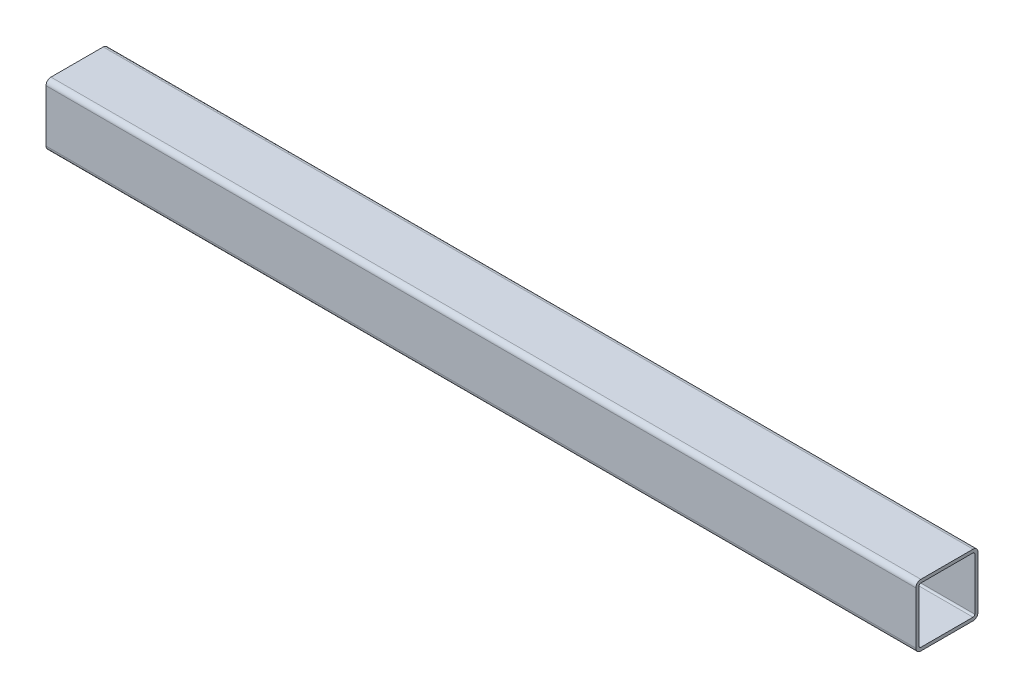
ISO-10303-21;
HEADER;
FILE_DESCRIPTION(('STEP AP214'),'2;1');
FILE_NAME('part.step','',(''),(''),'','','');
FILE_SCHEMA(('AUTOMOTIVE_DESIGN { 1 0 10303 214 1 1 1 1 }'));
ENDSEC;
DATA;
#1=APPLICATION_CONTEXT('core data for automotive mechanical design processes');
#2=APPLICATION_PROTOCOL_DEFINITION('international standard','automotive_design',2000,#1);
#3=PRODUCT_CONTEXT('',#1,'mechanical');
#4=PRODUCT('Part','Part','',(#3));
#5=PRODUCT_RELATED_PRODUCT_CATEGORY('part','',(#4));
#6=PRODUCT_DEFINITION_FORMATION('','',#4);
#7=PRODUCT_DEFINITION_CONTEXT('part definition',#1,'design');
#8=PRODUCT_DEFINITION('design','',#6,#7);
#9=PRODUCT_DEFINITION_SHAPE('','',#8);
#10=(LENGTH_UNIT() NAMED_UNIT(*) SI_UNIT(.MILLI.,.METRE.));
#11=(NAMED_UNIT(*) PLANE_ANGLE_UNIT() SI_UNIT($,.RADIAN.));
#12=(NAMED_UNIT(*) SI_UNIT($,.STERADIAN.) SOLID_ANGLE_UNIT());
#13=UNCERTAINTY_MEASURE_WITH_UNIT(LENGTH_MEASURE(1.E-05),#10,'distance_accuracy_value','');
#14=(GEOMETRIC_REPRESENTATION_CONTEXT(3) GLOBAL_UNCERTAINTY_ASSIGNED_CONTEXT((#13)) GLOBAL_UNIT_ASSIGNED_CONTEXT((#10,
#11,#12)) REPRESENTATION_CONTEXT('',''));
#15=CARTESIAN_POINT('',(0.,0.,0.));
#16=DIRECTION('',(0.,0.,1.));
#17=DIRECTION('',(1.,0.,0.));
#18=AXIS2_PLACEMENT_3D('',#15,#16,#17);
#19=CARTESIAN_POINT('',(177.8,10.541,21.209));
#20=DIRECTION('',(1.,0.,0.));
#21=DIRECTION('',(0.,0.,-1.));
#22=AXIS2_PLACEMENT_3D('',#19,#20,#21);
#23=PLANE('',#22);
#24=CARTESIAN_POINT('',(177.8,10.541,21.209));
#25=DIRECTION('',(1.,0.,0.));
#26=DIRECTION('',(0.,1.,0.));
#27=AXIS2_PLACEMENT_3D('',#24,#25,#26);
#28=CIRCLE('',#27,1.016);
#29=CARTESIAN_POINT('',(177.8,10.541,22.225));
#30=VERTEX_POINT('',#29);
#31=CARTESIAN_POINT('',(177.8,9.525,21.209));
#32=VERTEX_POINT('',#31);
#33=EDGE_CURVE('E266',#30,#32,#28,.T.);
#34=ORIENTED_EDGE('',*,*,#33,.T.);
#35=DIRECTION('',(0.,0.,-1.));
#36=VECTOR('',#35,1.);
#37=CARTESIAN_POINT('',(177.8,9.525,21.209));
#38=LINE('',#37,#36);
#39=CARTESIAN_POINT('',(177.8,9.525,10.541));
#40=VERTEX_POINT('',#39);
#41=EDGE_CURVE('E482',#32,#40,#38,.T.);
#42=ORIENTED_EDGE('',*,*,#41,.T.);
#43=CARTESIAN_POINT('',(177.8,10.541,10.541));
#44=DIRECTION('',(1.,0.,0.));
#45=DIRECTION('',(0.,0.,-1.));
#46=AXIS2_PLACEMENT_3D('',#43,#44,#45);
#47=CIRCLE('',#46,1.016);
#48=CARTESIAN_POINT('',(177.8,10.541,9.525));
#49=VERTEX_POINT('',#48);
#50=EDGE_CURVE('E167',#40,#49,#47,.T.);
#51=ORIENTED_EDGE('',*,*,#50,.T.);
#52=DIRECTION('',(0.,1.,0.));
#53=VECTOR('',#52,1.);
#54=CARTESIAN_POINT('',(177.8,10.541,9.525));
#55=LINE('',#54,#53);
#56=CARTESIAN_POINT('',(177.8,21.209,9.525));
#57=VERTEX_POINT('',#56);
#58=EDGE_CURVE('E468',#49,#57,#55,.T.);
#59=ORIENTED_EDGE('',*,*,#58,.T.);
#60=CARTESIAN_POINT('',(177.8,21.209,10.541));
#61=DIRECTION('',(1.,0.,0.));
#62=DIRECTION('',(0.,0.,-1.));
#63=AXIS2_PLACEMENT_3D('',#60,#61,#62);
#64=CIRCLE('',#63,1.016);
#65=CARTESIAN_POINT('',(177.8,22.225,10.541));
#66=VERTEX_POINT('',#65);
#67=EDGE_CURVE('E477',#57,#66,#64,.T.);
#68=ORIENTED_EDGE('',*,*,#67,.T.);
#69=DIRECTION('',(0.,0.,1.));
#70=VECTOR('',#69,1.);
#71=CARTESIAN_POINT('',(177.8,22.225,10.541));
#72=LINE('',#71,#70);
#73=CARTESIAN_POINT('',(177.8,22.225,21.209));
#74=VERTEX_POINT('',#73);
#75=EDGE_CURVE('E282',#66,#74,#72,.T.);
#76=ORIENTED_EDGE('',*,*,#75,.T.);
#77=CARTESIAN_POINT('',(177.8,21.209,21.209));
#78=DIRECTION('',(1.,0.,0.));
#79=DIRECTION('',(0.,0.,-1.));
#80=AXIS2_PLACEMENT_3D('',#77,#78,#79);
#81=CIRCLE('',#80,1.01599999999999);
#82=CARTESIAN_POINT('',(177.8,21.209,22.225));
#83=VERTEX_POINT('',#82);
#84=EDGE_CURVE('E299',#74,#83,#81,.T.);
#85=ORIENTED_EDGE('',*,*,#84,.T.);
#86=DIRECTION('',(0.,-1.,0.));
#87=VECTOR('',#86,1.);
#88=CARTESIAN_POINT('',(177.8,21.209,22.225));
#89=LINE('',#88,#87);
#90=EDGE_CURVE('E263',#83,#30,#89,.T.);
#91=ORIENTED_EDGE('',*,*,#90,.T.);
#92=EDGE_LOOP('',(#34,#42,#51,#59,#68,#76,#85,#91));
#93=FACE_BOUND('',#92,.T.);
#94=DIRECTION('',(0.,1.,0.));
#95=VECTOR('',#94,1.);
#96=CARTESIAN_POINT('',(177.8,10.541,10.1854));
#97=LINE('',#96,#95);
#98=CARTESIAN_POINT('',(177.8,10.541,10.1854));
#99=VERTEX_POINT('',#98);
#100=CARTESIAN_POINT('',(177.8,21.209,10.1854));
#101=VERTEX_POINT('',#100);
#102=EDGE_CURVE('E259',#99,#101,#97,.T.);
#103=ORIENTED_EDGE('',*,*,#102,.F.);
#104=CARTESIAN_POINT('',(177.8,10.541,10.541));
#105=DIRECTION('',(1.,0.,0.));
#106=DIRECTION('',(0.,0.,-1.));
#107=AXIS2_PLACEMENT_3D('',#104,#105,#106);
#108=CIRCLE('',#107,0.355599999999999);
#109=CARTESIAN_POINT('',(177.8,10.1854,10.541));
#110=VERTEX_POINT('',#109);
#111=EDGE_CURVE('E106',#110,#99,#108,.T.);
#112=ORIENTED_EDGE('',*,*,#111,.F.);
#113=DIRECTION('',(0.,0.,-1.));
#114=VECTOR('',#113,1.);
#115=CARTESIAN_POINT('',(177.8,10.1854,21.209));
#116=LINE('',#115,#114);
#117=CARTESIAN_POINT('',(177.8,10.1854,21.209));
#118=VERTEX_POINT('',#117);
#119=EDGE_CURVE('E218',#118,#110,#116,.T.);
#120=ORIENTED_EDGE('',*,*,#119,.F.);
#121=CARTESIAN_POINT('',(177.8,10.541,21.209));
#122=DIRECTION('',(1.,1.33244463861567E-13,-1.33244463861573E-13));
#123=DIRECTION('',(-1.33244463861573E-13,0.,-1.));
#124=AXIS2_PLACEMENT_3D('',#121,#122,#123);
#125=CIRCLE('',#124,0.3556);
#126=CARTESIAN_POINT('',(177.8,10.541,21.5646));
#127=VERTEX_POINT('',#126);
#128=EDGE_CURVE('E249',#127,#118,#125,.T.);
#129=ORIENTED_EDGE('',*,*,#128,.F.);
#130=DIRECTION('',(0.,-1.,0.));
#131=VECTOR('',#130,1.);
#132=CARTESIAN_POINT('',(177.8,21.209,21.5646));
#133=LINE('',#132,#131);
#134=CARTESIAN_POINT('',(177.8,21.209,21.5646));
#135=VERTEX_POINT('',#134);
#136=EDGE_CURVE('E235',#135,#127,#133,.T.);
#137=ORIENTED_EDGE('',*,*,#136,.F.);
#138=CARTESIAN_POINT('',(177.8,21.209,21.209));
#139=DIRECTION('',(1.,0.,0.));
#140=DIRECTION('',(0.,0.,-1.));
#141=AXIS2_PLACEMENT_3D('',#138,#139,#140);
#142=CIRCLE('',#141,0.355599999999999);
#143=CARTESIAN_POINT('',(177.8,21.5646,21.209));
#144=VERTEX_POINT('',#143);
#145=EDGE_CURVE('E244',#144,#135,#142,.T.);
#146=ORIENTED_EDGE('',*,*,#145,.F.);
#147=DIRECTION('',(0.,0.,1.));
#148=VECTOR('',#147,1.);
#149=CARTESIAN_POINT('',(177.8,21.5646,10.541));
#150=LINE('',#149,#148);
#151=CARTESIAN_POINT('',(177.8,21.5646,10.541));
#152=VERTEX_POINT('',#151);
#153=EDGE_CURVE('E252',#152,#144,#150,.T.);
#154=ORIENTED_EDGE('',*,*,#153,.F.);
#155=CARTESIAN_POINT('',(177.8,21.209,10.541));
#156=DIRECTION('',(1.,0.,0.));
#157=DIRECTION('',(0.,0.,-1.));
#158=AXIS2_PLACEMENT_3D('',#155,#156,#157);
#159=CIRCLE('',#158,0.3556);
#160=EDGE_CURVE('E257',#101,#152,#159,.T.);
#161=ORIENTED_EDGE('',*,*,#160,.F.);
#162=EDGE_LOOP('',(#103,#112,#120,#129,#137,#146,#154,#161));
#163=FACE_BOUND('',#162,.T.);
#164=ADVANCED_FACE('F47',(#93,#163),#23,.T.);
#165=CARTESIAN_POINT('',(0.,10.541,21.209));
#166=DIRECTION('',(1.,0.,0.));
#167=DIRECTION('',(0.,0.,-1.));
#168=AXIS2_PLACEMENT_3D('',#165,#166,#167);
#169=PLANE('',#168);
#170=CARTESIAN_POINT('',(0.,10.541,21.209));
#171=DIRECTION('',(1.,0.,0.));
#172=DIRECTION('',(0.,0.,-1.));
#173=AXIS2_PLACEMENT_3D('',#170,#171,#172);
#174=CIRCLE('',#173,1.016);
#175=CARTESIAN_POINT('',(0.,10.541,22.225));
#176=VERTEX_POINT('',#175);
#177=CARTESIAN_POINT('',(0.,9.525,21.209));
#178=VERTEX_POINT('',#177);
#179=EDGE_CURVE('E160',#176,#178,#174,.T.);
#180=ORIENTED_EDGE('',*,*,#179,.F.);
#181=DIRECTION('',(0.,-1.,0.));
#182=VECTOR('',#181,1.);
#183=CARTESIAN_POINT('',(0.,21.209,22.225));
#184=LINE('',#183,#182);
#185=CARTESIAN_POINT('',(0.,21.209,22.225));
#186=VERTEX_POINT('',#185);
#187=EDGE_CURVE('E264',#186,#176,#184,.T.);
#188=ORIENTED_EDGE('',*,*,#187,.F.);
#189=CARTESIAN_POINT('',(0.,21.209,21.209));
#190=DIRECTION('',(1.,0.,0.));
#191=DIRECTION('',(0.,0.,-1.));
#192=AXIS2_PLACEMENT_3D('',#189,#190,#191);
#193=CIRCLE('',#192,1.01599999999999);
#194=CARTESIAN_POINT('',(0.,22.225,21.209));
#195=VERTEX_POINT('',#194);
#196=EDGE_CURVE('E267',#195,#186,#193,.T.);
#197=ORIENTED_EDGE('',*,*,#196,.F.);
#198=DIRECTION('',(0.,0.,1.));
#199=VECTOR('',#198,1.);
#200=CARTESIAN_POINT('',(0.,22.225,10.541));
#201=LINE('',#200,#199);
#202=CARTESIAN_POINT('',(0.,22.225,10.541));
#203=VERTEX_POINT('',#202);
#204=EDGE_CURVE('E269',#203,#195,#201,.T.);
#205=ORIENTED_EDGE('',*,*,#204,.F.);
#206=CARTESIAN_POINT('',(0.,21.209,10.541));
#207=DIRECTION('',(1.,0.,0.));
#208=DIRECTION('',(0.,0.,-1.));
#209=AXIS2_PLACEMENT_3D('',#206,#207,#208);
#210=CIRCLE('',#209,1.016);
#211=CARTESIAN_POINT('',(0.,21.209,9.525));
#212=VERTEX_POINT('',#211);
#213=EDGE_CURVE('E176',#212,#203,#210,.T.);
#214=ORIENTED_EDGE('',*,*,#213,.F.);
#215=DIRECTION('',(0.,1.,0.));
#216=VECTOR('',#215,1.);
#217=CARTESIAN_POINT('',(0.,10.541,9.525));
#218=LINE('',#217,#216);
#219=CARTESIAN_POINT('',(0.,10.541,9.525));
#220=VERTEX_POINT('',#219);
#221=EDGE_CURVE('E174',#220,#212,#218,.T.);
#222=ORIENTED_EDGE('',*,*,#221,.F.);
#223=CARTESIAN_POINT('',(0.,10.541,10.541));
#224=DIRECTION('',(1.,0.,0.));
#225=DIRECTION('',(0.,0.,-1.));
#226=AXIS2_PLACEMENT_3D('',#223,#224,#225);
#227=CIRCLE('',#226,1.016);
#228=CARTESIAN_POINT('',(0.,9.525,10.541));
#229=VERTEX_POINT('',#228);
#230=EDGE_CURVE('E159',#229,#220,#227,.T.);
#231=ORIENTED_EDGE('',*,*,#230,.F.);
#232=DIRECTION('',(0.,0.,-1.));
#233=VECTOR('',#232,1.);
#234=CARTESIAN_POINT('',(0.,9.525,21.209));
#235=LINE('',#234,#233);
#236=EDGE_CURVE('E149',#178,#229,#235,.T.);
#237=ORIENTED_EDGE('',*,*,#236,.F.);
#238=EDGE_LOOP('',(#180,#188,#197,#205,#214,#222,#231,#237));
#239=FACE_BOUND('',#238,.T.);
#240=CARTESIAN_POINT('',(0.,10.541,10.541));
#241=DIRECTION('',(1.,0.,0.));
#242=DIRECTION('',(0.,0.,-1.));
#243=AXIS2_PLACEMENT_3D('',#240,#241,#242);
#244=CIRCLE('',#243,0.355599999999999);
#245=CARTESIAN_POINT('',(0.,10.1854,10.541));
#246=VERTEX_POINT('',#245);
#247=CARTESIAN_POINT('',(0.,10.541,10.1854));
#248=VERTEX_POINT('',#247);
#249=EDGE_CURVE('E72',#246,#248,#244,.T.);
#250=ORIENTED_EDGE('',*,*,#249,.T.);
#251=DIRECTION('',(0.,1.,0.));
#252=VECTOR('',#251,1.);
#253=CARTESIAN_POINT('',(0.,10.541,10.1854));
#254=LINE('',#253,#252);
#255=CARTESIAN_POINT('',(0.,21.209,10.1854));
#256=VERTEX_POINT('',#255);
#257=EDGE_CURVE('E181',#248,#256,#254,.T.);
#258=ORIENTED_EDGE('',*,*,#257,.T.);
#259=CARTESIAN_POINT('',(0.,21.209,10.541));
#260=DIRECTION('',(1.,0.,0.));
#261=DIRECTION('',(0.,0.,-1.));
#262=AXIS2_PLACEMENT_3D('',#259,#260,#261);
#263=CIRCLE('',#262,0.3556);
#264=CARTESIAN_POINT('',(0.,21.5646,10.541));
#265=VERTEX_POINT('',#264);
#266=EDGE_CURVE('E184',#256,#265,#263,.T.);
#267=ORIENTED_EDGE('',*,*,#266,.T.);
#268=DIRECTION('',(0.,0.,1.));
#269=VECTOR('',#268,1.);
#270=CARTESIAN_POINT('',(0.,21.5646,10.541));
#271=LINE('',#270,#269);
#272=CARTESIAN_POINT('',(0.,21.5646,21.209));
#273=VERTEX_POINT('',#272);
#274=EDGE_CURVE('E187',#265,#273,#271,.T.);
#275=ORIENTED_EDGE('',*,*,#274,.T.);
#276=CARTESIAN_POINT('',(0.,21.209,21.209));
#277=DIRECTION('',(1.,0.,0.));
#278=DIRECTION('',(0.,0.,-1.));
#279=AXIS2_PLACEMENT_3D('',#276,#277,#278);
#280=CIRCLE('',#279,0.355599999999999);
#281=CARTESIAN_POINT('',(0.,21.209,21.5646));
#282=VERTEX_POINT('',#281);
#283=EDGE_CURVE('E190',#273,#282,#280,.T.);
#284=ORIENTED_EDGE('',*,*,#283,.T.);
#285=DIRECTION('',(0.,-1.,0.));
#286=VECTOR('',#285,1.);
#287=CARTESIAN_POINT('',(0.,21.209,21.5646));
#288=LINE('',#287,#286);
#289=CARTESIAN_POINT('',(0.,10.541,21.5646));
#290=VERTEX_POINT('',#289);
#291=EDGE_CURVE('E193',#282,#290,#288,.T.);
#292=ORIENTED_EDGE('',*,*,#291,.T.);
#293=CARTESIAN_POINT('',(0.,10.541,21.209));
#294=DIRECTION('',(1.,0.,0.));
#295=DIRECTION('',(0.,0.,-1.));
#296=AXIS2_PLACEMENT_3D('',#293,#294,#295);
#297=CIRCLE('',#296,0.3556);
#298=CARTESIAN_POINT('',(0.,10.1854,21.209));
#299=VERTEX_POINT('',#298);
#300=EDGE_CURVE('E196',#290,#299,#297,.T.);
#301=ORIENTED_EDGE('',*,*,#300,.T.);
#302=DIRECTION('',(0.,0.,-1.));
#303=VECTOR('',#302,1.);
#304=CARTESIAN_POINT('',(0.,10.1854,21.209));
#305=LINE('',#304,#303);
#306=EDGE_CURVE('E199',#299,#246,#305,.T.);
#307=ORIENTED_EDGE('',*,*,#306,.T.);
#308=EDGE_LOOP('',(#250,#258,#267,#275,#284,#292,#301,#307));
#309=FACE_BOUND('',#308,.T.);
#310=ADVANCED_FACE('F171',(#239,#309),#169,.F.);
#311=CARTESIAN_POINT('',(177.8,10.541,21.209));
#312=DIRECTION('',(-1.,0.,0.));
#313=DIRECTION('',(0.,0.,1.));
#314=AXIS2_PLACEMENT_3D('',#311,#312,#313);
#315=CYLINDRICAL_SURFACE('',#314,1.016);
#316=ORIENTED_EDGE('',*,*,#179,.T.);
#317=DIRECTION('',(-1.,0.,0.));
#318=VECTOR('',#317,1.);
#319=CARTESIAN_POINT('',(177.8,9.525,21.209));
#320=LINE('',#319,#318);
#321=EDGE_CURVE('E11',#32,#178,#320,.T.);
#322=ORIENTED_EDGE('',*,*,#321,.F.);
#323=ORIENTED_EDGE('',*,*,#33,.F.);
#324=DIRECTION('',(-1.,0.,0.));
#325=VECTOR('',#324,1.);
#326=CARTESIAN_POINT('',(177.8,10.541,22.225));
#327=LINE('',#326,#325);
#328=EDGE_CURVE('E215',#30,#176,#327,.T.);
#329=ORIENTED_EDGE('',*,*,#328,.T.);
#330=EDGE_LOOP('',(#316,#322,#323,#329));
#331=FACE_BOUND('',#330,.T.);
#332=ADVANCED_FACE('F328',(#331),#315,.T.);
#333=CARTESIAN_POINT('',(177.8,9.525,21.209));
#334=DIRECTION('',(0.,1.,0.));
#335=DIRECTION('',(0.,0.,1.));
#336=AXIS2_PLACEMENT_3D('',#333,#334,#335);
#337=PLANE('',#336);
#338=ORIENTED_EDGE('',*,*,#236,.T.);
#339=DIRECTION('',(-1.,0.,0.));
#340=VECTOR('',#339,1.);
#341=CARTESIAN_POINT('',(177.8,9.525,10.541));
#342=LINE('',#341,#340);
#343=EDGE_CURVE('E56',#40,#229,#342,.T.);
#344=ORIENTED_EDGE('',*,*,#343,.F.);
#345=ORIENTED_EDGE('',*,*,#41,.F.);
#346=ORIENTED_EDGE('',*,*,#321,.T.);
#347=EDGE_LOOP('',(#338,#344,#345,#346));
#348=FACE_BOUND('',#347,.T.);
#349=ADVANCED_FACE('F153',(#348),#337,.F.);
#350=CARTESIAN_POINT('',(177.8,10.541,10.541));
#351=DIRECTION('',(-1.,0.,0.));
#352=DIRECTION('',(0.,0.,1.));
#353=AXIS2_PLACEMENT_3D('',#350,#351,#352);
#354=CYLINDRICAL_SURFACE('',#353,1.016);
#355=ORIENTED_EDGE('',*,*,#230,.T.);
#356=DIRECTION('',(-1.,0.,0.));
#357=VECTOR('',#356,1.);
#358=CARTESIAN_POINT('',(177.8,10.541,9.525));
#359=LINE('',#358,#357);
#360=EDGE_CURVE('E168',#49,#220,#359,.T.);
#361=ORIENTED_EDGE('',*,*,#360,.F.);
#362=ORIENTED_EDGE('',*,*,#50,.F.);
#363=ORIENTED_EDGE('',*,*,#343,.T.);
#364=EDGE_LOOP('',(#355,#361,#362,#363));
#365=FACE_BOUND('',#364,.T.);
#366=ADVANCED_FACE('F163',(#365),#354,.T.);
#367=CARTESIAN_POINT('',(177.8,10.541,9.525));
#368=DIRECTION('',(0.,0.,1.));
#369=DIRECTION('',(1.,0.,0.));
#370=AXIS2_PLACEMENT_3D('',#367,#368,#369);
#371=PLANE('',#370);
#372=ORIENTED_EDGE('',*,*,#221,.T.);
#373=DIRECTION('',(-1.,0.,0.));
#374=VECTOR('',#373,1.);
#375=CARTESIAN_POINT('',(177.8,21.209,9.525));
#376=LINE('',#375,#374);
#377=EDGE_CURVE('E203',#57,#212,#376,.T.);
#378=ORIENTED_EDGE('',*,*,#377,.F.);
#379=ORIENTED_EDGE('',*,*,#58,.F.);
#380=ORIENTED_EDGE('',*,*,#360,.T.);
#381=EDGE_LOOP('',(#372,#378,#379,#380));
#382=FACE_BOUND('',#381,.T.);
#383=ADVANCED_FACE('F338',(#382),#371,.F.);
#384=CARTESIAN_POINT('',(177.8,21.209,10.541));
#385=DIRECTION('',(-1.,0.,0.));
#386=DIRECTION('',(0.,0.,1.));
#387=AXIS2_PLACEMENT_3D('',#384,#385,#386);
#388=CYLINDRICAL_SURFACE('',#387,1.016);
#389=ORIENTED_EDGE('',*,*,#213,.T.);
#390=DIRECTION('',(-1.,0.,0.));
#391=VECTOR('',#390,1.);
#392=CARTESIAN_POINT('',(177.8,22.225,10.541));
#393=LINE('',#392,#391);
#394=EDGE_CURVE('E206',#66,#203,#393,.T.);
#395=ORIENTED_EDGE('',*,*,#394,.F.);
#396=ORIENTED_EDGE('',*,*,#67,.F.);
#397=ORIENTED_EDGE('',*,*,#377,.T.);
#398=EDGE_LOOP('',(#389,#395,#396,#397));
#399=FACE_BOUND('',#398,.T.);
#400=ADVANCED_FACE('F272',(#399),#388,.T.);
#401=CARTESIAN_POINT('',(177.8,22.225,10.541));
#402=DIRECTION('',(0.,-1.,0.));
#403=DIRECTION('',(0.,0.,-1.));
#404=AXIS2_PLACEMENT_3D('',#401,#402,#403);
#405=PLANE('',#404);
#406=ORIENTED_EDGE('',*,*,#204,.T.);
#407=DIRECTION('',(-1.,0.,0.));
#408=VECTOR('',#407,1.);
#409=CARTESIAN_POINT('',(177.8,22.225,21.209));
#410=LINE('',#409,#408);
#411=EDGE_CURVE('E209',#74,#195,#410,.T.);
#412=ORIENTED_EDGE('',*,*,#411,.F.);
#413=ORIENTED_EDGE('',*,*,#75,.F.);
#414=ORIENTED_EDGE('',*,*,#394,.T.);
#415=EDGE_LOOP('',(#406,#412,#413,#414));
#416=FACE_BOUND('',#415,.T.);
#417=ADVANCED_FACE('F279',(#416),#405,.F.);
#418=CARTESIAN_POINT('',(177.8,21.209,21.209));
#419=DIRECTION('',(-1.,0.,0.));
#420=DIRECTION('',(0.,0.,1.));
#421=AXIS2_PLACEMENT_3D('',#418,#419,#420);
#422=CYLINDRICAL_SURFACE('',#421,1.016);
#423=ORIENTED_EDGE('',*,*,#196,.T.);
#424=DIRECTION('',(-1.,0.,0.));
#425=VECTOR('',#424,1.);
#426=CARTESIAN_POINT('',(177.8,21.209,22.225));
#427=LINE('',#426,#425);
#428=EDGE_CURVE('E212',#83,#186,#427,.T.);
#429=ORIENTED_EDGE('',*,*,#428,.F.);
#430=ORIENTED_EDGE('',*,*,#84,.F.);
#431=ORIENTED_EDGE('',*,*,#411,.T.);
#432=EDGE_LOOP('',(#423,#429,#430,#431));
#433=FACE_BOUND('',#432,.T.);
#434=ADVANCED_FACE('F287',(#433),#422,.T.);
#435=CARTESIAN_POINT('',(177.8,21.209,22.225));
#436=DIRECTION('',(0.,0.,-1.));
#437=DIRECTION('',(0.,1.,0.));
#438=AXIS2_PLACEMENT_3D('',#435,#436,#437);
#439=PLANE('',#438);
#440=ORIENTED_EDGE('',*,*,#187,.T.);
#441=ORIENTED_EDGE('',*,*,#328,.F.);
#442=ORIENTED_EDGE('',*,*,#90,.F.);
#443=ORIENTED_EDGE('',*,*,#428,.T.);
#444=EDGE_LOOP('',(#440,#441,#442,#443));
#445=FACE_BOUND('',#444,.T.);
#446=ADVANCED_FACE('F291',(#445),#439,.F.);
#447=CARTESIAN_POINT('',(177.8,10.541,10.541));
#448=DIRECTION('',(-1.,0.,0.));
#449=DIRECTION('',(0.,0.,1.));
#450=AXIS2_PLACEMENT_3D('',#447,#448,#449);
#451=CYLINDRICAL_SURFACE('',#450,0.3556);
#452=ORIENTED_EDGE('',*,*,#249,.F.);
#453=DIRECTION('',(-1.,0.,0.));
#454=VECTOR('',#453,1.);
#455=CARTESIAN_POINT('',(177.8,10.1854,10.541));
#456=LINE('',#455,#454);
#457=EDGE_CURVE('E216',#110,#246,#456,.T.);
#458=ORIENTED_EDGE('',*,*,#457,.F.);
#459=ORIENTED_EDGE('',*,*,#111,.T.);
#460=DIRECTION('',(-1.,0.,0.));
#461=VECTOR('',#460,1.);
#462=CARTESIAN_POINT('',(177.8,10.541,10.1854));
#463=LINE('',#462,#461);
#464=EDGE_CURVE('E219',#99,#248,#463,.T.);
#465=ORIENTED_EDGE('',*,*,#464,.T.);
#466=EDGE_LOOP('',(#452,#458,#459,#465));
#467=FACE_BOUND('',#466,.T.);
#468=ADVANCED_FACE('F305',(#467),#451,.F.);
#469=CARTESIAN_POINT('',(177.8,10.541,10.1854));
#470=DIRECTION('',(0.,0.,1.));
#471=DIRECTION('',(1.,0.,0.));
#472=AXIS2_PLACEMENT_3D('',#469,#470,#471);
#473=PLANE('',#472);
#474=ORIENTED_EDGE('',*,*,#257,.F.);
#475=ORIENTED_EDGE('',*,*,#464,.F.);
#476=ORIENTED_EDGE('',*,*,#102,.T.);
#477=DIRECTION('',(-1.,0.,0.));
#478=VECTOR('',#477,1.);
#479=CARTESIAN_POINT('',(177.8,21.209,10.1854));
#480=LINE('',#479,#478);
#481=EDGE_CURVE('E221',#101,#256,#480,.T.);
#482=ORIENTED_EDGE('',*,*,#481,.T.);
#483=EDGE_LOOP('',(#474,#475,#476,#482));
#484=FACE_BOUND('',#483,.T.);
#485=ADVANCED_FACE('F309',(#484),#473,.T.);
#486=CARTESIAN_POINT('',(177.8,21.209,10.541));
#487=DIRECTION('',(-1.,0.,0.));
#488=DIRECTION('',(0.,0.,1.));
#489=AXIS2_PLACEMENT_3D('',#486,#487,#488);
#490=CYLINDRICAL_SURFACE('',#489,0.3556);
#491=ORIENTED_EDGE('',*,*,#266,.F.);
#492=ORIENTED_EDGE('',*,*,#481,.F.);
#493=ORIENTED_EDGE('',*,*,#160,.T.);
#494=DIRECTION('',(-1.,0.,0.));
#495=VECTOR('',#494,1.);
#496=CARTESIAN_POINT('',(177.8,21.5646,10.541));
#497=LINE('',#496,#495);
#498=EDGE_CURVE('E223',#152,#265,#497,.T.);
#499=ORIENTED_EDGE('',*,*,#498,.T.);
#500=EDGE_LOOP('',(#491,#492,#493,#499));
#501=FACE_BOUND('',#500,.T.);
#502=ADVANCED_FACE('F312',(#501),#490,.F.);
#503=CARTESIAN_POINT('',(177.8,21.5646,10.541));
#504=DIRECTION('',(0.,-1.,0.));
#505=DIRECTION('',(0.,0.,-1.));
#506=AXIS2_PLACEMENT_3D('',#503,#504,#505);
#507=PLANE('',#506);
#508=ORIENTED_EDGE('',*,*,#274,.F.);
#509=ORIENTED_EDGE('',*,*,#498,.F.);
#510=ORIENTED_EDGE('',*,*,#153,.T.);
#511=DIRECTION('',(-1.,0.,0.));
#512=VECTOR('',#511,1.);
#513=CARTESIAN_POINT('',(177.8,21.5646,21.209));
#514=LINE('',#513,#512);
#515=EDGE_CURVE('E225',#144,#273,#514,.T.);
#516=ORIENTED_EDGE('',*,*,#515,.T.);
#517=EDGE_LOOP('',(#508,#509,#510,#516));
#518=FACE_BOUND('',#517,.T.);
#519=ADVANCED_FACE('F315',(#518),#507,.T.);
#520=CARTESIAN_POINT('',(177.8,21.209,21.209));
#521=DIRECTION('',(-1.,0.,0.));
#522=DIRECTION('',(0.,0.,1.));
#523=AXIS2_PLACEMENT_3D('',#520,#521,#522);
#524=CYLINDRICAL_SURFACE('',#523,0.355600000000001);
#525=ORIENTED_EDGE('',*,*,#283,.F.);
#526=ORIENTED_EDGE('',*,*,#515,.F.);
#527=ORIENTED_EDGE('',*,*,#145,.T.);
#528=DIRECTION('',(-1.,0.,0.));
#529=VECTOR('',#528,1.);
#530=CARTESIAN_POINT('',(177.8,21.209,21.5646));
#531=LINE('',#530,#529);
#532=EDGE_CURVE('E227',#135,#282,#531,.T.);
#533=ORIENTED_EDGE('',*,*,#532,.T.);
#534=EDGE_LOOP('',(#525,#526,#527,#533));
#535=FACE_BOUND('',#534,.T.);
#536=ADVANCED_FACE('F242',(#535),#524,.F.);
#537=CARTESIAN_POINT('',(177.8,21.209,21.5646));
#538=DIRECTION('',(0.,0.,-1.));
#539=DIRECTION('',(-1.,0.,0.));
#540=AXIS2_PLACEMENT_3D('',#537,#538,#539);
#541=PLANE('',#540);
#542=ORIENTED_EDGE('',*,*,#291,.F.);
#543=ORIENTED_EDGE('',*,*,#532,.F.);
#544=ORIENTED_EDGE('',*,*,#136,.T.);
#545=DIRECTION('',(-1.,0.,0.));
#546=VECTOR('',#545,1.);
#547=CARTESIAN_POINT('',(177.8,10.541,21.5646));
#548=LINE('',#547,#546);
#549=EDGE_CURVE('E228',#127,#290,#548,.T.);
#550=ORIENTED_EDGE('',*,*,#549,.T.);
#551=EDGE_LOOP('',(#542,#543,#544,#550));
#552=FACE_BOUND('',#551,.T.);
#553=ADVANCED_FACE('F232',(#552),#541,.T.);
#554=CARTESIAN_POINT('',(177.8,10.541,21.209));
#555=DIRECTION('',(-1.,0.,0.));
#556=DIRECTION('',(0.,0.,1.));
#557=AXIS2_PLACEMENT_3D('',#554,#555,#556);
#558=CYLINDRICAL_SURFACE('',#557,0.355600000000003);
#559=ORIENTED_EDGE('',*,*,#300,.F.);
#560=ORIENTED_EDGE('',*,*,#549,.F.);
#561=ORIENTED_EDGE('',*,*,#128,.T.);
#562=DIRECTION('',(-1.,0.,0.));
#563=VECTOR('',#562,1.);
#564=CARTESIAN_POINT('',(177.8,10.1854,21.209));
#565=LINE('',#564,#563);
#566=EDGE_CURVE('E51',#118,#299,#565,.T.);
#567=ORIENTED_EDGE('',*,*,#566,.T.);
#568=EDGE_LOOP('',(#559,#560,#561,#567));
#569=FACE_BOUND('',#568,.T.);
#570=ADVANCED_FACE('F237',(#569),#558,.F.);
#571=CARTESIAN_POINT('',(177.8,10.1854,21.209));
#572=DIRECTION('',(0.,1.,0.));
#573=DIRECTION('',(0.,0.,1.));
#574=AXIS2_PLACEMENT_3D('',#571,#572,#573);
#575=PLANE('',#574);
#576=ORIENTED_EDGE('',*,*,#306,.F.);
#577=ORIENTED_EDGE('',*,*,#566,.F.);
#578=ORIENTED_EDGE('',*,*,#119,.T.);
#579=ORIENTED_EDGE('',*,*,#457,.T.);
#580=EDGE_LOOP('',(#576,#577,#578,#579));
#581=FACE_BOUND('',#580,.T.);
#582=ADVANCED_FACE('F49',(#581),#575,.T.);
#583=CLOSED_SHELL('',(#164,#310,#332,#349,#366,#383,#400,#417,#434,#446,#468,#485,#502,#519,
#536,#553,#570,#582));
#584=MANIFOLD_SOLID_BREP('B2',#583);
#585=ADVANCED_BREP_SHAPE_REPRESENTATION('',(#18,#584),#14);
#586=SHAPE_DEFINITION_REPRESENTATION(#9,#585);
ENDSEC;
END-ISO-10303-21;
